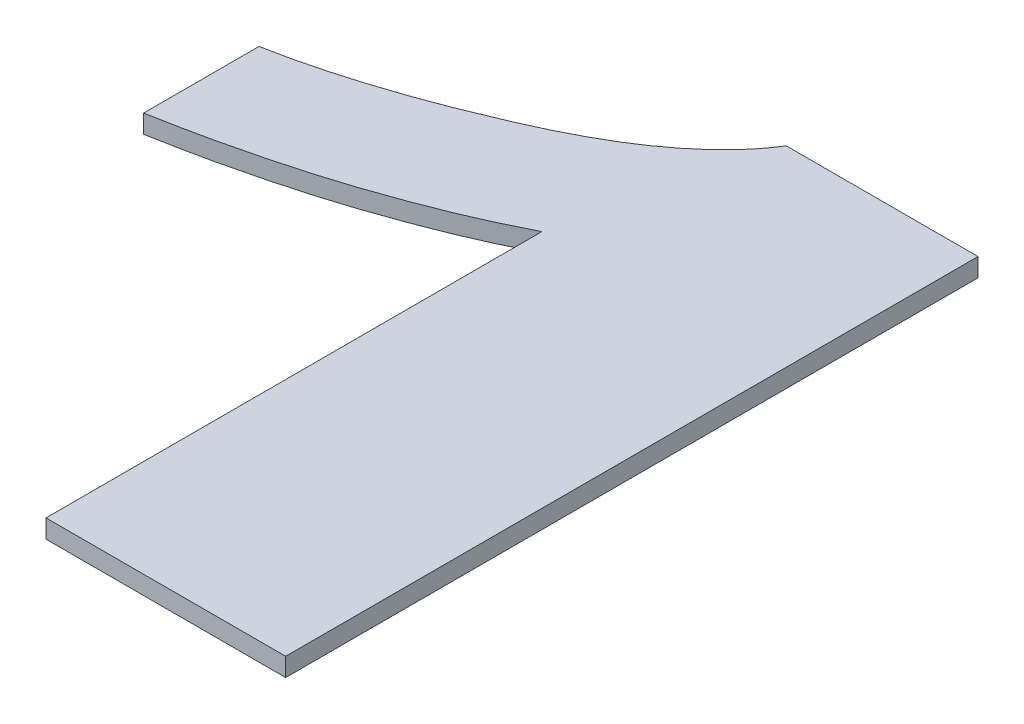
ISO-10303-21;
HEADER;
FILE_DESCRIPTION(('STEP AP214'),'2;1');
FILE_NAME('part.step','',(''),(''),'','','');
FILE_SCHEMA(('AUTOMOTIVE_DESIGN { 1 0 10303 214 1 1 1 1 }'));
ENDSEC;
DATA;
#1=APPLICATION_CONTEXT('core data for automotive mechanical design processes');
#2=APPLICATION_PROTOCOL_DEFINITION('international standard','automotive_design',2000,#1);
#3=PRODUCT_CONTEXT('',#1,'mechanical');
#4=PRODUCT('Part','Part','',(#3));
#5=PRODUCT_RELATED_PRODUCT_CATEGORY('part','',(#4));
#6=PRODUCT_DEFINITION_FORMATION('','',#4);
#7=PRODUCT_DEFINITION_CONTEXT('part definition',#1,'design');
#8=PRODUCT_DEFINITION('design','',#6,#7);
#9=PRODUCT_DEFINITION_SHAPE('','',#8);
#10=(LENGTH_UNIT() NAMED_UNIT(*) SI_UNIT(.MILLI.,.METRE.));
#11=(NAMED_UNIT(*) PLANE_ANGLE_UNIT() SI_UNIT($,.RADIAN.));
#12=(NAMED_UNIT(*) SI_UNIT($,.STERADIAN.) SOLID_ANGLE_UNIT());
#13=UNCERTAINTY_MEASURE_WITH_UNIT(LENGTH_MEASURE(1.E-05),#10,'distance_accuracy_value','');
#14=(GEOMETRIC_REPRESENTATION_CONTEXT(3) GLOBAL_UNCERTAINTY_ASSIGNED_CONTEXT((#13)) GLOBAL_UNIT_ASSIGNED_CONTEXT((#10,
#11,#12)) REPRESENTATION_CONTEXT('',''));
#15=CARTESIAN_POINT('',(0.,0.,0.));
#16=DIRECTION('',(0.,0.,1.));
#17=DIRECTION('',(1.,0.,0.));
#18=AXIS2_PLACEMENT_3D('',#15,#16,#17);
#19=CARTESIAN_POINT('',(11.9511983411568,0.8,-30.));
#20=DIRECTION('',(1.,0.,0.));
#21=DIRECTION('',(0.,0.,-1.));
#22=AXIS2_PLACEMENT_3D('',#19,#20,#21);
#23=PLANE('',#22);
#24=DIRECTION('',(0.,0.,1.));
#25=VECTOR('',#24,1.);
#26=CARTESIAN_POINT('',(11.9511983411568,0.,-30.));
#27=LINE('',#26,#25);
#28=CARTESIAN_POINT('',(11.9511983411568,0.,-30.));
#29=VERTEX_POINT('',#28);
#30=CARTESIAN_POINT('',(11.9511983411568,0.,0.));
#31=VERTEX_POINT('',#30);
#32=EDGE_CURVE('E160',#29,#31,#27,.T.);
#33=ORIENTED_EDGE('',*,*,#32,.F.);
#34=DIRECTION('',(0.,-1.,0.));
#35=VECTOR('',#34,1.);
#36=CARTESIAN_POINT('',(11.9511983411568,0.8,-30.));
#37=LINE('',#36,#35);
#38=CARTESIAN_POINT('',(11.9511983411568,0.8,-30.));
#39=VERTEX_POINT('',#38);
#40=EDGE_CURVE('E11',#39,#29,#37,.T.);
#41=ORIENTED_EDGE('',*,*,#40,.F.);
#42=DIRECTION('',(0.,0.,1.));
#43=VECTOR('',#42,1.);
#44=CARTESIAN_POINT('',(11.9511983411568,0.8,-30.));
#45=LINE('',#44,#43);
#46=CARTESIAN_POINT('',(11.9511983411568,0.8,0.));
#47=VERTEX_POINT('',#46);
#48=EDGE_CURVE('E166',#39,#47,#45,.T.);
#49=ORIENTED_EDGE('',*,*,#48,.T.);
#50=DIRECTION('',(0.,-1.,0.));
#51=VECTOR('',#50,1.);
#52=CARTESIAN_POINT('',(11.9511983411568,0.8,0.));
#53=LINE('',#52,#51);
#54=EDGE_CURVE('E36',#47,#31,#53,.T.);
#55=ORIENTED_EDGE('',*,*,#54,.T.);
#56=EDGE_LOOP('',(#33,#41,#49,#55));
#57=FACE_BOUND('',#56,.T.);
#58=ADVANCED_FACE('F33',(#57),#23,.T.);
#59=CARTESIAN_POINT('',(3.64590987961829,0.8,-30.));
#60=DIRECTION('',(0.,0.,-1.));
#61=DIRECTION('',(-1.,0.,0.));
#62=AXIS2_PLACEMENT_3D('',#59,#60,#61);
#63=PLANE('',#62);
#64=DIRECTION('',(1.,0.,0.));
#65=VECTOR('',#64,1.);
#66=CARTESIAN_POINT('',(3.64590987961829,0.,-30.));
#67=LINE('',#66,#65);
#68=CARTESIAN_POINT('',(3.64590987961829,0.,-30.));
#69=VERTEX_POINT('',#68);
#70=EDGE_CURVE('E165',#69,#29,#67,.T.);
#71=ORIENTED_EDGE('',*,*,#70,.F.);
#72=DIRECTION('',(0.,-1.,0.));
#73=VECTOR('',#72,1.);
#74=CARTESIAN_POINT('',(3.64590987961829,0.8,-30.));
#75=LINE('',#74,#73);
#76=CARTESIAN_POINT('',(3.64590987961829,0.8,-30.));
#77=VERTEX_POINT('',#76);
#78=EDGE_CURVE('E42',#77,#69,#75,.T.);
#79=ORIENTED_EDGE('',*,*,#78,.F.);
#80=DIRECTION('',(1.,0.,0.));
#81=VECTOR('',#80,1.);
#82=CARTESIAN_POINT('',(3.64590987961829,0.8,-30.));
#83=LINE('',#82,#81);
#84=EDGE_CURVE('E114',#77,#39,#83,.T.);
#85=ORIENTED_EDGE('',*,*,#84,.T.);
#86=ORIENTED_EDGE('',*,*,#40,.T.);
#87=EDGE_LOOP('',(#71,#79,#85,#86));
#88=FACE_BOUND('',#87,.T.);
#89=ADVANCED_FACE('F137',(#88),#63,.T.);
#90=CARTESIAN_POINT('',(-11.5103401203817,0.8,-22.3076923076923));
#91=CARTESIAN_POINT('',(-11.1711061861954,0.8,-22.372634387048));
#92=CARTESIAN_POINT('',(-10.4834533354521,0.8,-22.5042768953638));
#93=CARTESIAN_POINT('',(-9.4516687546461,0.8,-22.7635924809078));
#94=CARTESIAN_POINT('',(-8.39369246999977,0.8,-23.0494554151987));
#95=CARTESIAN_POINT('',(-7.31747666176574,0.8,-23.3887648114375));
#96=CARTESIAN_POINT('',(-6.21624769949731,0.8,-23.7600455564158));
#97=CARTESIAN_POINT('',(-5.09514426991337,0.8,-24.1749393915062));
#98=CARTESIAN_POINT('',(-3.95640583716947,0.8,-24.6421920886312));
#99=CARTESIAN_POINT('',(-2.8044589821681,0.8,-25.1278376980999));
#100=CARTESIAN_POINT('',(-1.69110450738451,0.8,-25.6522194602526));
#101=CARTESIAN_POINT('',(-0.654736291574656,0.8,-26.2066905658582));
#102=CARTESIAN_POINT('',(0.295578873220692,0.8,-26.7745896114809));
#103=CARTESIAN_POINT('',(1.14784265902177,0.8,-27.3773236837707));
#104=CARTESIAN_POINT('',(1.91507532887721,0.8,-27.9933115349037));
#105=CARTESIAN_POINT('',(2.58624883423704,0.8,-28.6344849402794));
#106=CARTESIAN_POINT('',(3.17274788819304,0.8,-29.2922731999299));
#107=CARTESIAN_POINT('',(3.490689657952,0.8,-29.7678310752409));
#108=CARTESIAN_POINT('',(3.64590987961829,0.8,-30.));
#109=B_SPLINE_CURVE_WITH_KNOTS('',3,(#90,#91,#92,#93,#94,#95,#96,#97,#98,#99,#100,#101,#102,
#103,#104,#105,#106,#107,#108),.UNSPECIFIED.,.F.,.F.,(4,1,1,1,1,1,1,1,1,1,1,1,1,1,1,1,4),(0.,
0.0596584911591199,0.120932275289652,0.183732190042314,0.248970703084012,0.315838378905958,
0.384494739242794,0.455443417902687,0.528468448434817,0.600452806680032,0.667957769068686,
0.731464116783082,0.791569621619419,0.848158911301502,0.901275450897373,0.95180234919359,1.),.UNSPECIFIED.);
#110=DIRECTION('',(0.,-1.,0.));
#111=VECTOR('',#110,1.);
#112=SURFACE_OF_LINEAR_EXTRUSION('',#109,#111);
#113=CARTESIAN_POINT('',(-11.5103401203817,0.,-22.3076923076923));
#114=CARTESIAN_POINT('',(-11.1711061861954,0.,-22.372634387048));
#115=CARTESIAN_POINT('',(-10.4834533354521,0.,-22.5042768953638));
#116=CARTESIAN_POINT('',(-9.4516687546461,0.,-22.7635924809078));
#117=CARTESIAN_POINT('',(-8.39369246999977,0.,-23.0494554151987));
#118=CARTESIAN_POINT('',(-7.31747666176574,0.,-23.3887648114375));
#119=CARTESIAN_POINT('',(-6.21624769949731,0.,-23.7600455564158));
#120=CARTESIAN_POINT('',(-5.09514426991337,0.,-24.1749393915062));
#121=CARTESIAN_POINT('',(-3.95640583716947,0.,-24.6421920886312));
#122=CARTESIAN_POINT('',(-2.8044589821681,0.,-25.1278376980999));
#123=CARTESIAN_POINT('',(-1.69110450738451,0.,-25.6522194602526));
#124=CARTESIAN_POINT('',(-0.654736291574656,0.,-26.2066905658582));
#125=CARTESIAN_POINT('',(0.295578873220692,0.,-26.7745896114809));
#126=CARTESIAN_POINT('',(1.14784265902177,0.,-27.3773236837707));
#127=CARTESIAN_POINT('',(1.91507532887721,0.,-27.9933115349037));
#128=CARTESIAN_POINT('',(2.58624883423704,0.,-28.6344849402794));
#129=CARTESIAN_POINT('',(3.17274788819304,0.,-29.2922731999299));
#130=CARTESIAN_POINT('',(3.490689657952,0.,-29.7678310752409));
#131=CARTESIAN_POINT('',(3.64590987961829,0.,-30.));
#132=B_SPLINE_CURVE_WITH_KNOTS('',3,(#113,#114,#115,#116,#117,#118,#119,#120,#121,#122,#123,
#124,#125,#126,#127,#128,#129,#130,#131),.UNSPECIFIED.,.F.,.F.,(4,1,1,1,1,1,1,1,1,1,1,1,1,1,1,1,
4),(0.,0.0596584911591199,0.120932275289652,0.183732190042314,0.248970703084012,
0.315838378905958,0.384494739242794,0.455443417902687,0.528468448434817,0.600452806680032,
0.667957769068686,0.731464116783082,0.791569621619419,0.848158911301502,0.901275450897373,
0.95180234919359,1.),.UNSPECIFIED.);
#133=CARTESIAN_POINT('',(-11.5103401203817,0.,-22.3076923076923));
#134=VERTEX_POINT('',#133);
#135=EDGE_CURVE('E101',#134,#69,#132,.T.);
#136=ORIENTED_EDGE('',*,*,#135,.F.);
#137=DIRECTION('',(0.,-1.,0.));
#138=VECTOR('',#137,1.);
#139=CARTESIAN_POINT('',(-11.5103401203817,0.8,-22.3076923076923));
#140=LINE('',#139,#138);
#141=CARTESIAN_POINT('',(-11.5103401203817,0.8,-22.3076923076923));
#142=VERTEX_POINT('',#141);
#143=EDGE_CURVE('E96',#142,#134,#140,.T.);
#144=ORIENTED_EDGE('',*,*,#143,.F.);
#145=EDGE_CURVE('E99',#142,#77,#109,.T.);
#146=ORIENTED_EDGE('',*,*,#145,.T.);
#147=ORIENTED_EDGE('',*,*,#78,.T.);
#148=EDGE_LOOP('',(#136,#144,#146,#147));
#149=FACE_BOUND('',#148,.T.);
#150=ADVANCED_FACE('F98',(#149),#112,.T.);
#151=CARTESIAN_POINT('',(-11.5103401203817,0.8,-17.3076923076923));
#152=DIRECTION('',(-1.,0.,0.));
#153=DIRECTION('',(0.,0.,1.));
#154=AXIS2_PLACEMENT_3D('',#151,#152,#153);
#155=PLANE('',#154);
#156=DIRECTION('',(0.,0.,-1.));
#157=VECTOR('',#156,1.);
#158=CARTESIAN_POINT('',(-11.5103401203817,0.,-17.3076923076923));
#159=LINE('',#158,#157);
#160=CARTESIAN_POINT('',(-11.5103401203817,0.,-17.3076923076923));
#161=VERTEX_POINT('',#160);
#162=EDGE_CURVE('E170',#161,#134,#159,.T.);
#163=ORIENTED_EDGE('',*,*,#162,.F.);
#164=DIRECTION('',(0.,-1.,0.));
#165=VECTOR('',#164,1.);
#166=CARTESIAN_POINT('',(-11.5103401203817,0.8,-17.3076923076923));
#167=LINE('',#166,#165);
#168=CARTESIAN_POINT('',(-11.5103401203817,0.8,-17.3076923076923));
#169=VERTEX_POINT('',#168);
#170=EDGE_CURVE('E106',#169,#161,#167,.T.);
#171=ORIENTED_EDGE('',*,*,#170,.F.);
#172=DIRECTION('',(0.,0.,-1.));
#173=VECTOR('',#172,1.);
#174=CARTESIAN_POINT('',(-11.5103401203817,0.8,-17.3076923076923));
#175=LINE('',#174,#173);
#176=EDGE_CURVE('E112',#169,#142,#175,.T.);
#177=ORIENTED_EDGE('',*,*,#176,.T.);
#178=ORIENTED_EDGE('',*,*,#143,.T.);
#179=EDGE_LOOP('',(#163,#171,#177,#178));
#180=FACE_BOUND('',#179,.T.);
#181=ADVANCED_FACE('F116',(#180),#155,.T.);
#182=CARTESIAN_POINT('',(1.56658295654137,0.8,-21.484375));
#183=CARTESIAN_POINT('',(1.09582052842886,0.8,-21.251760804241));
#184=CARTESIAN_POINT('',(0.143924464720708,0.8,-20.7814077682237));
#185=CARTESIAN_POINT('',(-1.33916282558753,0.8,-20.1461019990437));
#186=CARTESIAN_POINT('',(-2.88306399091537,0.8,-19.5611565817128));
#187=CARTESIAN_POINT('',(-4.48645324607591,0.8,-19.0092013163067));
#188=CARTESIAN_POINT('',(-6.15370284215718,0.8,-18.5145373876632));
#189=CARTESIAN_POINT('',(-7.88399317979582,0.8,-18.064343747194));
#190=CARTESIAN_POINT('',(-9.67278507712607,0.8,-17.6525514370653));
#191=CARTESIAN_POINT('',(-10.8924858967817,0.8,-17.4236467496624));
#192=CARTESIAN_POINT('',(-11.5103401203817,0.8,-17.3076923076923));
#193=B_SPLINE_CURVE_WITH_KNOTS('',3,(#182,#183,#184,#185,#186,#187,#188,#189,#190,#191,#192),
.UNSPECIFIED.,.F.,.F.,(4,1,1,1,1,1,1,1,4),(0.,0.114332813269215,0.231184453993073,
0.351170539942873,0.473810791578853,0.600373048937335,0.729776047281601,0.863114783712228,1.),.UNSPECIFIED.);
#194=DIRECTION('',(0.,-1.,0.));
#195=VECTOR('',#194,1.);
#196=SURFACE_OF_LINEAR_EXTRUSION('',#193,#195);
#197=CARTESIAN_POINT('',(1.56658295654137,0.,-21.484375));
#198=CARTESIAN_POINT('',(1.09582052842886,0.,-21.251760804241));
#199=CARTESIAN_POINT('',(0.143924464720708,0.,-20.7814077682237));
#200=CARTESIAN_POINT('',(-1.33916282558753,0.,-20.1461019990437));
#201=CARTESIAN_POINT('',(-2.88306399091537,0.,-19.5611565817128));
#202=CARTESIAN_POINT('',(-4.48645324607591,0.,-19.0092013163067));
#203=CARTESIAN_POINT('',(-6.15370284215718,0.,-18.5145373876632));
#204=CARTESIAN_POINT('',(-7.88399317979582,0.,-18.064343747194));
#205=CARTESIAN_POINT('',(-9.67278507712607,0.,-17.6525514370653));
#206=CARTESIAN_POINT('',(-10.8924858967817,0.,-17.4236467496624));
#207=CARTESIAN_POINT('',(-11.5103401203817,0.,-17.3076923076923));
#208=B_SPLINE_CURVE_WITH_KNOTS('',3,(#197,#198,#199,#200,#201,#202,#203,#204,#205,#206,#207),
.UNSPECIFIED.,.F.,.F.,(4,1,1,1,1,1,1,1,4),(0.,0.114332813269215,0.231184453993073,
0.351170539942873,0.473810791578853,0.600373048937335,0.729776047281601,0.863114783712228,1.),.UNSPECIFIED.);
#209=CARTESIAN_POINT('',(1.56658295654137,0.,-21.484375));
#210=VERTEX_POINT('',#209);
#211=EDGE_CURVE('E187',#210,#161,#208,.T.);
#212=ORIENTED_EDGE('',*,*,#211,.F.);
#213=DIRECTION('',(0.,-1.,0.));
#214=VECTOR('',#213,1.);
#215=CARTESIAN_POINT('',(1.56658295654137,0.8,-21.484375));
#216=LINE('',#215,#214);
#217=CARTESIAN_POINT('',(1.56658295654137,0.8,-21.484375));
#218=VERTEX_POINT('',#217);
#219=EDGE_CURVE('E178',#218,#210,#216,.T.);
#220=ORIENTED_EDGE('',*,*,#219,.F.);
#221=EDGE_CURVE('E117',#218,#169,#193,.T.);
#222=ORIENTED_EDGE('',*,*,#221,.T.);
#223=ORIENTED_EDGE('',*,*,#170,.T.);
#224=EDGE_LOOP('',(#212,#220,#222,#223));
#225=FACE_BOUND('',#224,.T.);
#226=ADVANCED_FACE('F141',(#225),#196,.T.);
#227=CARTESIAN_POINT('',(1.56658295654137,0.8,0.));
#228=DIRECTION('',(-1.,0.,0.));
#229=DIRECTION('',(0.,0.,1.));
#230=AXIS2_PLACEMENT_3D('',#227,#228,#229);
#231=PLANE('',#230);
#232=DIRECTION('',(0.,0.,-1.));
#233=VECTOR('',#232,1.);
#234=CARTESIAN_POINT('',(1.56658295654137,0.,0.));
#235=LINE('',#234,#233);
#236=CARTESIAN_POINT('',(1.56658295654137,0.,0.));
#237=VERTEX_POINT('',#236);
#238=EDGE_CURVE('E184',#237,#210,#235,.T.);
#239=ORIENTED_EDGE('',*,*,#238,.F.);
#240=DIRECTION('',(0.,-1.,0.));
#241=VECTOR('',#240,1.);
#242=CARTESIAN_POINT('',(1.56658295654137,0.8,0.));
#243=LINE('',#242,#241);
#244=CARTESIAN_POINT('',(1.56658295654137,0.8,0.));
#245=VERTEX_POINT('',#244);
#246=EDGE_CURVE('E179',#245,#237,#243,.T.);
#247=ORIENTED_EDGE('',*,*,#246,.F.);
#248=DIRECTION('',(0.,0.,-1.));
#249=VECTOR('',#248,1.);
#250=CARTESIAN_POINT('',(1.56658295654137,0.8,0.));
#251=LINE('',#250,#249);
#252=EDGE_CURVE('E119',#245,#218,#251,.T.);
#253=ORIENTED_EDGE('',*,*,#252,.T.);
#254=ORIENTED_EDGE('',*,*,#219,.T.);
#255=EDGE_LOOP('',(#239,#247,#253,#254));
#256=FACE_BOUND('',#255,.T.);
#257=ADVANCED_FACE('F144',(#256),#231,.T.);
#258=CARTESIAN_POINT('',(11.9511983411568,0.8,0.));
#259=DIRECTION('',(0.,0.,1.));
#260=DIRECTION('',(1.,0.,0.));
#261=AXIS2_PLACEMENT_3D('',#258,#259,#260);
#262=PLANE('',#261);
#263=DIRECTION('',(-1.,0.,0.));
#264=VECTOR('',#263,1.);
#265=CARTESIAN_POINT('',(11.9511983411568,0.,0.));
#266=LINE('',#265,#264);
#267=EDGE_CURVE('E164',#31,#237,#266,.T.);
#268=ORIENTED_EDGE('',*,*,#267,.F.);
#269=ORIENTED_EDGE('',*,*,#54,.F.);
#270=DIRECTION('',(-1.,0.,0.));
#271=VECTOR('',#270,1.);
#272=CARTESIAN_POINT('',(11.9511983411568,0.8,0.));
#273=LINE('',#272,#271);
#274=EDGE_CURVE('E168',#47,#245,#273,.T.);
#275=ORIENTED_EDGE('',*,*,#274,.T.);
#276=ORIENTED_EDGE('',*,*,#246,.T.);
#277=EDGE_LOOP('',(#268,#269,#275,#276));
#278=FACE_BOUND('',#277,.T.);
#279=ADVANCED_FACE('F147',(#278),#262,.T.);
#280=CARTESIAN_POINT('',(-4.81713439008255,0.8,-18.9178009330954));
#281=DIRECTION('',(0.,1.,0.));
#282=DIRECTION('',(0.,0.,1.));
#283=AXIS2_PLACEMENT_3D('',#280,#281,#282);
#284=PLANE('',#283);
#285=ORIENTED_EDGE('',*,*,#48,.F.);
#286=ORIENTED_EDGE('',*,*,#84,.F.);
#287=ORIENTED_EDGE('',*,*,#145,.F.);
#288=ORIENTED_EDGE('',*,*,#176,.F.);
#289=ORIENTED_EDGE('',*,*,#221,.F.);
#290=ORIENTED_EDGE('',*,*,#252,.F.);
#291=ORIENTED_EDGE('',*,*,#274,.F.);
#292=EDGE_LOOP('',(#285,#286,#287,#288,#289,#290,#291));
#293=FACE_BOUND('',#292,.T.);
#294=ADVANCED_FACE('F110',(#293),#284,.T.);
#295=CARTESIAN_POINT('',(-4.81713439008255,0.,-18.9178009330954));
#296=DIRECTION('',(0.,1.,0.));
#297=DIRECTION('',(0.,0.,1.));
#298=AXIS2_PLACEMENT_3D('',#295,#296,#297);
#299=PLANE('',#298);
#300=ORIENTED_EDGE('',*,*,#32,.T.);
#301=ORIENTED_EDGE('',*,*,#267,.T.);
#302=ORIENTED_EDGE('',*,*,#238,.T.);
#303=ORIENTED_EDGE('',*,*,#211,.T.);
#304=ORIENTED_EDGE('',*,*,#162,.T.);
#305=ORIENTED_EDGE('',*,*,#135,.T.);
#306=ORIENTED_EDGE('',*,*,#70,.T.);
#307=EDGE_LOOP('',(#300,#301,#302,#303,#304,#305,#306));
#308=FACE_BOUND('',#307,.T.);
#309=ADVANCED_FACE('F153',(#308),#299,.F.);
#310=CLOSED_SHELL('',(#58,#89,#150,#181,#226,#257,#279,#294,#309));
#311=MANIFOLD_SOLID_BREP('B2',#310);
#312=ADVANCED_BREP_SHAPE_REPRESENTATION('',(#18,#311),#14);
#313=SHAPE_DEFINITION_REPRESENTATION(#9,#312);
ENDSEC;
END-ISO-10303-21;
